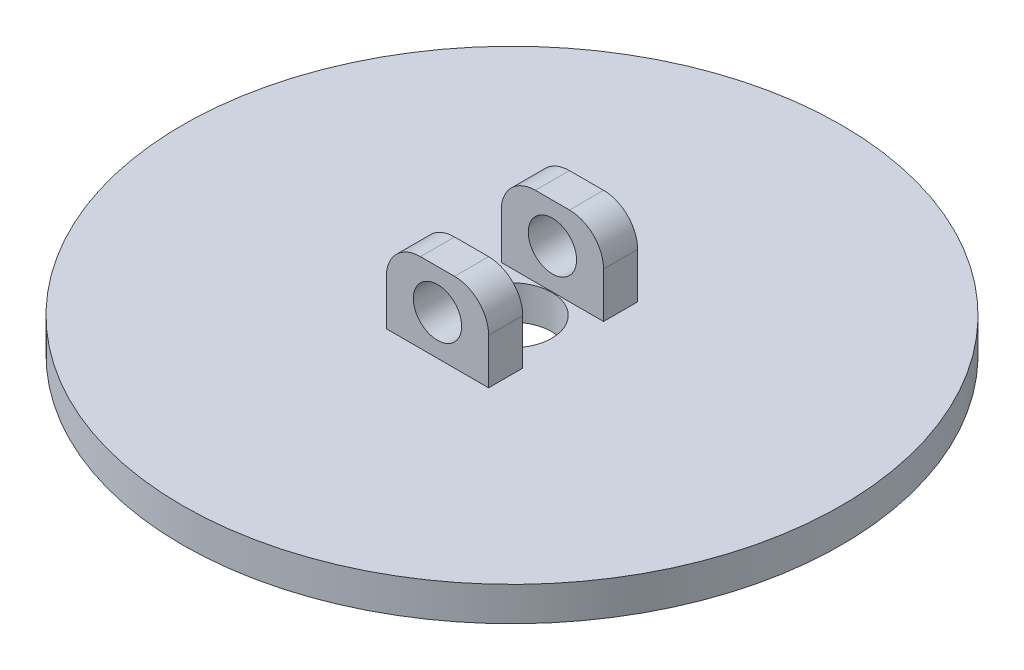
ISO-10303-21;
HEADER;
FILE_DESCRIPTION(('STEP AP214'),'2;1');
FILE_NAME('part.step','',(''),(''),'','','');
FILE_SCHEMA(('AUTOMOTIVE_DESIGN { 1 0 10303 214 1 1 1 1 }'));
ENDSEC;
DATA;
#1=APPLICATION_CONTEXT('core data for automotive mechanical design processes');
#2=APPLICATION_PROTOCOL_DEFINITION('international standard','automotive_design',2000,#1);
#3=PRODUCT_CONTEXT('',#1,'mechanical');
#4=PRODUCT('Part','Part','',(#3));
#5=PRODUCT_RELATED_PRODUCT_CATEGORY('part','',(#4));
#6=PRODUCT_DEFINITION_FORMATION('','',#4);
#7=PRODUCT_DEFINITION_CONTEXT('part definition',#1,'design');
#8=PRODUCT_DEFINITION('design','',#6,#7);
#9=PRODUCT_DEFINITION_SHAPE('','',#8);
#10=(LENGTH_UNIT() NAMED_UNIT(*) SI_UNIT(.MILLI.,.METRE.));
#11=(NAMED_UNIT(*) PLANE_ANGLE_UNIT() SI_UNIT($,.RADIAN.));
#12=(NAMED_UNIT(*) SI_UNIT($,.STERADIAN.) SOLID_ANGLE_UNIT());
#13=UNCERTAINTY_MEASURE_WITH_UNIT(LENGTH_MEASURE(1.E-05),#10,'distance_accuracy_value','');
#14=(GEOMETRIC_REPRESENTATION_CONTEXT(3) GLOBAL_UNCERTAINTY_ASSIGNED_CONTEXT((#13)) GLOBAL_UNIT_ASSIGNED_CONTEXT((#10,
#11,#12)) REPRESENTATION_CONTEXT('',''));
#15=CARTESIAN_POINT('',(0.,0.,0.));
#16=DIRECTION('',(0.,0.,1.));
#17=DIRECTION('',(1.,0.,0.));
#18=AXIS2_PLACEMENT_3D('',#15,#16,#17);
#19=CARTESIAN_POINT('',(4.5,10.,-6.55561035524943));
#20=DIRECTION('',(-1.,0.,0.));
#21=DIRECTION('',(0.,0.,1.));
#22=AXIS2_PLACEMENT_3D('',#19,#20,#21);
#23=PLANE('',#22);
#24=DIRECTION('',(0.,0.,-1.));
#25=VECTOR('',#24,1.);
#26=CARTESIAN_POINT('',(4.5,6.99999999999998,139.539641300568));
#27=LINE('',#26,#25);
#28=CARTESIAN_POINT('',(4.5,6.99999999999998,-3.55561035524943));
#29=VERTEX_POINT('',#28);
#30=CARTESIAN_POINT('',(4.5,6.99999999999998,-6.55561035524943));
#31=VERTEX_POINT('',#30);
#32=EDGE_CURVE('E415',#29,#31,#27,.T.);
#33=ORIENTED_EDGE('',*,*,#32,.F.);
#34=DIRECTION('',(0.,-1.,0.));
#35=VECTOR('',#34,1.);
#36=CARTESIAN_POINT('',(4.5,10.,-3.55561035524943));
#37=LINE('',#36,#35);
#38=CARTESIAN_POINT('',(4.5,3.,-3.55561035524943));
#39=VERTEX_POINT('',#38);
#40=EDGE_CURVE('E177',#29,#39,#37,.T.);
#41=ORIENTED_EDGE('',*,*,#40,.T.);
#42=DIRECTION('',(0.,0.,-1.));
#43=VECTOR('',#42,1.);
#44=CARTESIAN_POINT('',(4.5,3.,-6.55561035524943));
#45=LINE('',#44,#43);
#46=CARTESIAN_POINT('',(4.5,3.,-6.55561035524943));
#47=VERTEX_POINT('',#46);
#48=EDGE_CURVE('E170',#39,#47,#45,.T.);
#49=ORIENTED_EDGE('',*,*,#48,.T.);
#50=DIRECTION('',(0.,-1.,0.));
#51=VECTOR('',#50,1.);
#52=CARTESIAN_POINT('',(4.5,10.,-6.55561035524943));
#53=LINE('',#52,#51);
#54=EDGE_CURVE('E193',#31,#47,#53,.T.);
#55=ORIENTED_EDGE('',*,*,#54,.F.);
#56=EDGE_LOOP('',(#33,#41,#49,#55));
#57=FACE_BOUND('',#56,.T.);
#58=ADVANCED_FACE('F33',(#57),#23,.F.);
#59=CARTESIAN_POINT('',(-4.5,10.,-6.55561035524943));
#60=DIRECTION('',(0.,0.,1.));
#61=DIRECTION('',(1.,0.,0.));
#62=AXIS2_PLACEMENT_3D('',#59,#60,#61);
#63=PLANE('',#62);
#64=CARTESIAN_POINT('',(0.,6.5,-6.55561035524943));
#65=DIRECTION('',(0.,0.,1.));
#66=DIRECTION('',(1.,0.,0.));
#67=AXIS2_PLACEMENT_3D('',#64,#65,#66);
#68=CIRCLE('',#67,2.125);
#69=CARTESIAN_POINT('',(2.125,6.5,-6.55561035524943));
#70=VERTEX_POINT('',#69);
#71=EDGE_CURVE('E154',#70,#70,#68,.T.);
#72=ORIENTED_EDGE('',*,*,#71,.T.);
#73=EDGE_LOOP('',(#72));
#74=FACE_BOUND('',#73,.T.);
#75=CARTESIAN_POINT('',(-1.5,7.,-6.55561035524943));
#76=DIRECTION('',(0.,0.,1.));
#77=DIRECTION('',(1.,0.,0.));
#78=AXIS2_PLACEMENT_3D('',#75,#76,#77);
#79=CIRCLE('',#78,3.);
#80=CARTESIAN_POINT('',(-1.49999999999998,10.,-6.55561035524943));
#81=VERTEX_POINT('',#80);
#82=CARTESIAN_POINT('',(-4.5,7.,-6.55561035524943));
#83=VERTEX_POINT('',#82);
#84=EDGE_CURVE('E208',#81,#83,#79,.T.);
#85=ORIENTED_EDGE('',*,*,#84,.F.);
#86=DIRECTION('',(-1.,0.,0.));
#87=VECTOR('',#86,1.);
#88=CARTESIAN_POINT('',(-4.5,10.,-6.55561035524943));
#89=LINE('',#88,#87);
#90=CARTESIAN_POINT('',(1.5,10.,-6.55561035524943));
#91=VERTEX_POINT('',#90);
#92=EDGE_CURVE('E171',#91,#81,#89,.T.);
#93=ORIENTED_EDGE('',*,*,#92,.F.);
#94=CARTESIAN_POINT('',(1.5,7.,-6.55561035524943));
#95=DIRECTION('',(0.,0.,1.));
#96=DIRECTION('',(1.,0.,0.));
#97=AXIS2_PLACEMENT_3D('',#94,#95,#96);
#98=CIRCLE('',#97,3.);
#99=EDGE_CURVE('E402',#31,#91,#98,.T.);
#100=ORIENTED_EDGE('',*,*,#99,.F.);
#101=ORIENTED_EDGE('',*,*,#54,.T.);
#102=DIRECTION('',(-1.,0.,0.));
#103=VECTOR('',#102,1.);
#104=CARTESIAN_POINT('',(-4.5,3.,-6.55561035524943));
#105=LINE('',#104,#103);
#106=CARTESIAN_POINT('',(-4.5,3.,-6.55561035524943));
#107=VERTEX_POINT('',#106);
#108=EDGE_CURVE('E180',#47,#107,#105,.T.);
#109=ORIENTED_EDGE('',*,*,#108,.T.);
#110=DIRECTION('',(0.,-1.,0.));
#111=VECTOR('',#110,1.);
#112=CARTESIAN_POINT('',(-4.5,10.,-6.55561035524943));
#113=LINE('',#112,#111);
#114=EDGE_CURVE('E191',#83,#107,#113,.T.);
#115=ORIENTED_EDGE('',*,*,#114,.F.);
#116=EDGE_LOOP('',(#85,#93,#100,#101,#109,#115));
#117=FACE_BOUND('',#116,.T.);
#118=ADVANCED_FACE('F228',(#74,#117),#63,.F.);
#119=CARTESIAN_POINT('',(-4.5,10.,-3.55561035524943));
#120=DIRECTION('',(0.,0.,-1.));
#121=DIRECTION('',(-1.,0.,0.));
#122=AXIS2_PLACEMENT_3D('',#119,#120,#121);
#123=PLANE('',#122);
#124=CARTESIAN_POINT('',(0.,6.5,-3.55561035524943));
#125=DIRECTION('',(0.,0.,-1.));
#126=DIRECTION('',(-1.,0.,0.));
#127=AXIS2_PLACEMENT_3D('',#124,#125,#126);
#128=CIRCLE('',#127,2.125);
#129=CARTESIAN_POINT('',(2.125,6.5,-3.55561035524943));
#130=VERTEX_POINT('',#129);
#131=EDGE_CURVE('E212',#130,#130,#128,.T.);
#132=ORIENTED_EDGE('',*,*,#131,.T.);
#133=EDGE_LOOP('',(#132));
#134=FACE_BOUND('',#133,.T.);
#135=CARTESIAN_POINT('',(-1.5,7.,-3.55561035524943));
#136=DIRECTION('',(0.,0.,-1.));
#137=DIRECTION('',(-1.,0.,0.));
#138=AXIS2_PLACEMENT_3D('',#135,#136,#137);
#139=CIRCLE('',#138,3.);
#140=CARTESIAN_POINT('',(-4.5,7.,-3.55561035524943));
#141=VERTEX_POINT('',#140);
#142=CARTESIAN_POINT('',(-1.49999999999998,10.,-3.55561035524943));
#143=VERTEX_POINT('',#142);
#144=EDGE_CURVE('E58',#141,#143,#139,.T.);
#145=ORIENTED_EDGE('',*,*,#144,.F.);
#146=DIRECTION('',(0.,-1.,0.));
#147=VECTOR('',#146,1.);
#148=CARTESIAN_POINT('',(-4.5,10.,-3.55561035524943));
#149=LINE('',#148,#147);
#150=CARTESIAN_POINT('',(-4.5,3.,-3.55561035524943));
#151=VERTEX_POINT('',#150);
#152=EDGE_CURVE('E189',#141,#151,#149,.T.);
#153=ORIENTED_EDGE('',*,*,#152,.T.);
#154=DIRECTION('',(1.,0.,0.));
#155=VECTOR('',#154,1.);
#156=CARTESIAN_POINT('',(-4.5,3.,-3.55561035524943));
#157=LINE('',#156,#155);
#158=EDGE_CURVE('E174',#151,#39,#157,.T.);
#159=ORIENTED_EDGE('',*,*,#158,.T.);
#160=ORIENTED_EDGE('',*,*,#40,.F.);
#161=CARTESIAN_POINT('',(1.5,7.,-3.55561035524943));
#162=DIRECTION('',(0.,0.,-1.));
#163=DIRECTION('',(-1.,0.,0.));
#164=AXIS2_PLACEMENT_3D('',#161,#162,#163);
#165=CIRCLE('',#164,3.);
#166=CARTESIAN_POINT('',(1.49999999999998,10.,-3.55561035524943));
#167=VERTEX_POINT('',#166);
#168=EDGE_CURVE('E142',#167,#29,#165,.T.);
#169=ORIENTED_EDGE('',*,*,#168,.F.);
#170=DIRECTION('',(1.,0.,0.));
#171=VECTOR('',#170,1.);
#172=CARTESIAN_POINT('',(-4.5,10.,-3.55561035524943));
#173=LINE('',#172,#171);
#174=EDGE_CURVE('E173',#143,#167,#173,.T.);
#175=ORIENTED_EDGE('',*,*,#174,.F.);
#176=EDGE_LOOP('',(#145,#153,#159,#160,#169,#175));
#177=FACE_BOUND('',#176,.T.);
#178=ADVANCED_FACE('F253',(#134,#177),#123,.F.);
#179=CARTESIAN_POINT('',(0.,10.,0.));
#180=DIRECTION('',(0.,1.,0.));
#181=DIRECTION('',(0.,0.,1.));
#182=AXIS2_PLACEMENT_3D('',#179,#180,#181);
#183=PLANE('',#182);
#184=DIRECTION('',(0.,0.,-1.));
#185=VECTOR('',#184,1.);
#186=CARTESIAN_POINT('',(-1.49999999999998,10.,139.539641300568));
#187=LINE('',#186,#185);
#188=EDGE_CURVE('E43',#143,#81,#187,.T.);
#189=ORIENTED_EDGE('',*,*,#188,.F.);
#190=ORIENTED_EDGE('',*,*,#174,.T.);
#191=DIRECTION('',(0.,0.,-1.));
#192=VECTOR('',#191,1.);
#193=CARTESIAN_POINT('',(1.49999999999998,10.,139.539641300568));
#194=LINE('',#193,#192);
#195=EDGE_CURVE('E411',#167,#91,#194,.T.);
#196=ORIENTED_EDGE('',*,*,#195,.T.);
#197=ORIENTED_EDGE('',*,*,#92,.T.);
#198=EDGE_LOOP('',(#189,#190,#196,#197));
#199=FACE_BOUND('',#198,.T.);
#200=ADVANCED_FACE('F331',(#199),#183,.T.);
#201=CARTESIAN_POINT('',(-4.5,10.,6.55561035524943));
#202=DIRECTION('',(0.,0.,-1.));
#203=DIRECTION('',(-1.,0.,0.));
#204=AXIS2_PLACEMENT_3D('',#201,#202,#203);
#205=PLANE('',#204);
#206=CARTESIAN_POINT('',(0.,6.5,6.55561035524943));
#207=DIRECTION('',(0.,0.,-1.));
#208=DIRECTION('',(-1.,0.,0.));
#209=AXIS2_PLACEMENT_3D('',#206,#207,#208);
#210=CIRCLE('',#209,2.125);
#211=CARTESIAN_POINT('',(2.125,6.5,6.55561035524943));
#212=VERTEX_POINT('',#211);
#213=EDGE_CURVE('E207',#212,#212,#210,.T.);
#214=ORIENTED_EDGE('',*,*,#213,.T.);
#215=EDGE_LOOP('',(#214));
#216=FACE_BOUND('',#215,.T.);
#217=CARTESIAN_POINT('',(-1.5,7.,6.55561035524943));
#218=DIRECTION('',(0.,0.,-1.));
#219=DIRECTION('',(-1.,0.,0.));
#220=AXIS2_PLACEMENT_3D('',#217,#218,#219);
#221=CIRCLE('',#220,3.);
#222=CARTESIAN_POINT('',(-4.5,7.,6.55561035524943));
#223=VERTEX_POINT('',#222);
#224=CARTESIAN_POINT('',(-1.49999999999998,10.,6.55561035524943));
#225=VERTEX_POINT('',#224);
#226=EDGE_CURVE('E219',#223,#225,#221,.T.);
#227=ORIENTED_EDGE('',*,*,#226,.F.);
#228=DIRECTION('',(0.,-1.,0.));
#229=VECTOR('',#228,1.);
#230=CARTESIAN_POINT('',(-4.5,10.,6.55561035524943));
#231=LINE('',#230,#229);
#232=CARTESIAN_POINT('',(-4.5,3.,6.55561035524943));
#233=VERTEX_POINT('',#232);
#234=EDGE_CURVE('E148',#223,#233,#231,.T.);
#235=ORIENTED_EDGE('',*,*,#234,.T.);
#236=DIRECTION('',(1.,0.,0.));
#237=VECTOR('',#236,1.);
#238=CARTESIAN_POINT('',(-4.5,3.,6.55561035524943));
#239=LINE('',#238,#237);
#240=CARTESIAN_POINT('',(4.5,3.,6.55561035524943));
#241=VERTEX_POINT('',#240);
#242=EDGE_CURVE('E157',#233,#241,#239,.T.);
#243=ORIENTED_EDGE('',*,*,#242,.T.);
#244=DIRECTION('',(0.,-1.,0.));
#245=VECTOR('',#244,1.);
#246=CARTESIAN_POINT('',(4.5,10.,6.55561035524943));
#247=LINE('',#246,#245);
#248=CARTESIAN_POINT('',(4.5,6.99999999999998,6.55561035524943));
#249=VERTEX_POINT('',#248);
#250=EDGE_CURVE('E141',#249,#241,#247,.T.);
#251=ORIENTED_EDGE('',*,*,#250,.F.);
#252=CARTESIAN_POINT('',(1.5,7.,6.55561035524943));
#253=DIRECTION('',(0.,0.,-1.));
#254=DIRECTION('',(-1.,0.,0.));
#255=AXIS2_PLACEMENT_3D('',#252,#253,#254);
#256=CIRCLE('',#255,3.);
#257=CARTESIAN_POINT('',(1.49999999999998,10.,6.55561035524943));
#258=VERTEX_POINT('',#257);
#259=EDGE_CURVE('E126',#258,#249,#256,.T.);
#260=ORIENTED_EDGE('',*,*,#259,.F.);
#261=DIRECTION('',(1.,0.,0.));
#262=VECTOR('',#261,1.);
#263=CARTESIAN_POINT('',(-4.5,10.,6.55561035524943));
#264=LINE('',#263,#262);
#265=EDGE_CURVE('E138',#225,#258,#264,.T.);
#266=ORIENTED_EDGE('',*,*,#265,.F.);
#267=EDGE_LOOP('',(#227,#235,#243,#251,#260,#266));
#268=FACE_BOUND('',#267,.T.);
#269=ADVANCED_FACE('F137',(#216,#268),#205,.F.);
#270=CARTESIAN_POINT('',(4.5,10.,6.55561035524943));
#271=DIRECTION('',(-1.,0.,0.));
#272=DIRECTION('',(0.,0.,1.));
#273=AXIS2_PLACEMENT_3D('',#270,#271,#272);
#274=PLANE('',#273);
#275=CARTESIAN_POINT('',(4.5,6.99999999999998,3.55561035524943));
#276=VERTEX_POINT('',#275);
#277=EDGE_CURVE('E414',#249,#276,#27,.T.);
#278=ORIENTED_EDGE('',*,*,#277,.F.);
#279=ORIENTED_EDGE('',*,*,#250,.T.);
#280=DIRECTION('',(0.,0.,-1.));
#281=VECTOR('',#280,1.);
#282=CARTESIAN_POINT('',(4.5,3.,6.55561035524943));
#283=LINE('',#282,#281);
#284=CARTESIAN_POINT('',(4.5,3.,3.55561035524943));
#285=VERTEX_POINT('',#284);
#286=EDGE_CURVE('E159',#241,#285,#283,.T.);
#287=ORIENTED_EDGE('',*,*,#286,.T.);
#288=DIRECTION('',(0.,-1.,0.));
#289=VECTOR('',#288,1.);
#290=CARTESIAN_POINT('',(4.5,10.,3.55561035524943));
#291=LINE('',#290,#289);
#292=EDGE_CURVE('E167',#276,#285,#291,.T.);
#293=ORIENTED_EDGE('',*,*,#292,.F.);
#294=EDGE_LOOP('',(#278,#279,#287,#293));
#295=FACE_BOUND('',#294,.T.);
#296=ADVANCED_FACE('F349',(#295),#274,.F.);
#297=CARTESIAN_POINT('',(-4.5,10.,3.55561035524943));
#298=DIRECTION('',(0.,0.,1.));
#299=DIRECTION('',(1.,0.,0.));
#300=AXIS2_PLACEMENT_3D('',#297,#298,#299);
#301=PLANE('',#300);
#302=CARTESIAN_POINT('',(0.,6.5,3.55561035524942));
#303=DIRECTION('',(0.,0.,1.));
#304=DIRECTION('',(1.,0.,0.));
#305=AXIS2_PLACEMENT_3D('',#302,#303,#304);
#306=CIRCLE('',#305,2.125);
#307=CARTESIAN_POINT('',(2.125,6.5,3.55561035524942));
#308=VERTEX_POINT('',#307);
#309=EDGE_CURVE('E205',#308,#308,#306,.T.);
#310=ORIENTED_EDGE('',*,*,#309,.T.);
#311=EDGE_LOOP('',(#310));
#312=FACE_BOUND('',#311,.T.);
#313=CARTESIAN_POINT('',(-1.5,7.,3.55561035524943));
#314=DIRECTION('',(0.,0.,1.));
#315=DIRECTION('',(1.,0.,0.));
#316=AXIS2_PLACEMENT_3D('',#313,#314,#315);
#317=CIRCLE('',#316,3.);
#318=CARTESIAN_POINT('',(-1.49999999999998,10.,3.55561035524943));
#319=VERTEX_POINT('',#318);
#320=CARTESIAN_POINT('',(-4.5,7.,3.55561035524943));
#321=VERTEX_POINT('',#320);
#322=EDGE_CURVE('E399',#319,#321,#317,.T.);
#323=ORIENTED_EDGE('',*,*,#322,.F.);
#324=DIRECTION('',(-1.,0.,0.));
#325=VECTOR('',#324,1.);
#326=CARTESIAN_POINT('',(-4.5,10.,3.55561035524943));
#327=LINE('',#326,#325);
#328=CARTESIAN_POINT('',(1.5,10.,3.55561035524943));
#329=VERTEX_POINT('',#328);
#330=EDGE_CURVE('E145',#329,#319,#327,.T.);
#331=ORIENTED_EDGE('',*,*,#330,.F.);
#332=CARTESIAN_POINT('',(1.5,7.,3.55561035524943));
#333=DIRECTION('',(0.,0.,1.));
#334=DIRECTION('',(1.,0.,0.));
#335=AXIS2_PLACEMENT_3D('',#332,#333,#334);
#336=CIRCLE('',#335,3.);
#337=EDGE_CURVE('E129',#276,#329,#336,.T.);
#338=ORIENTED_EDGE('',*,*,#337,.F.);
#339=ORIENTED_EDGE('',*,*,#292,.T.);
#340=DIRECTION('',(-1.,0.,0.));
#341=VECTOR('',#340,1.);
#342=CARTESIAN_POINT('',(-4.5,3.,3.55561035524943));
#343=LINE('',#342,#341);
#344=CARTESIAN_POINT('',(-4.5,3.,3.55561035524943));
#345=VERTEX_POINT('',#344);
#346=EDGE_CURVE('E151',#285,#345,#343,.T.);
#347=ORIENTED_EDGE('',*,*,#346,.T.);
#348=DIRECTION('',(0.,-1.,0.));
#349=VECTOR('',#348,1.);
#350=CARTESIAN_POINT('',(-4.5,10.,3.55561035524943));
#351=LINE('',#350,#349);
#352=EDGE_CURVE('E165',#321,#345,#351,.T.);
#353=ORIENTED_EDGE('',*,*,#352,.F.);
#354=EDGE_LOOP('',(#323,#331,#338,#339,#347,#353));
#355=FACE_BOUND('',#354,.T.);
#356=ADVANCED_FACE('F359',(#312,#355),#301,.F.);
#357=CARTESIAN_POINT('',(0.,10.,0.));
#358=DIRECTION('',(0.,1.,0.));
#359=DIRECTION('',(0.,0.,1.));
#360=AXIS2_PLACEMENT_3D('',#357,#358,#359);
#361=PLANE('',#360);
#362=EDGE_CURVE('E11',#225,#319,#187,.T.);
#363=ORIENTED_EDGE('',*,*,#362,.F.);
#364=ORIENTED_EDGE('',*,*,#265,.T.);
#365=DIRECTION('',(0.,0.,-1.));
#366=VECTOR('',#365,1.);
#367=CARTESIAN_POINT('',(1.5,10.,139.539641300568));
#368=LINE('',#367,#366);
#369=EDGE_CURVE('E37',#258,#329,#368,.T.);
#370=ORIENTED_EDGE('',*,*,#369,.T.);
#371=ORIENTED_EDGE('',*,*,#330,.T.);
#372=EDGE_LOOP('',(#363,#364,#370,#371));
#373=FACE_BOUND('',#372,.T.);
#374=ADVANCED_FACE('F144',(#373),#361,.T.);
#375=CARTESIAN_POINT('',(0.,3.,0.));
#376=DIRECTION('',(0.,1.,0.));
#377=DIRECTION('',(0.,0.,1.));
#378=AXIS2_PLACEMENT_3D('',#375,#376,#377);
#379=PLANE('',#378);
#380=DIRECTION('',(0.,0.,1.));
#381=VECTOR('',#380,1.);
#382=CARTESIAN_POINT('',(-4.5,3.,-6.55561035524943));
#383=LINE('',#382,#381);
#384=EDGE_CURVE('E183',#107,#151,#383,.T.);
#385=ORIENTED_EDGE('',*,*,#384,.F.);
#386=ORIENTED_EDGE('',*,*,#108,.F.);
#387=ORIENTED_EDGE('',*,*,#48,.F.);
#388=ORIENTED_EDGE('',*,*,#158,.F.);
#389=EDGE_LOOP('',(#385,#386,#387,#388));
#390=FACE_BOUND('',#389,.T.);
#391=DIRECTION('',(0.,0.,1.));
#392=VECTOR('',#391,1.);
#393=CARTESIAN_POINT('',(-4.5,3.,6.55561035524943));
#394=LINE('',#393,#392);
#395=EDGE_CURVE('E146',#345,#233,#394,.T.);
#396=ORIENTED_EDGE('',*,*,#395,.F.);
#397=ORIENTED_EDGE('',*,*,#346,.F.);
#398=ORIENTED_EDGE('',*,*,#286,.F.);
#399=ORIENTED_EDGE('',*,*,#242,.F.);
#400=EDGE_LOOP('',(#396,#397,#398,#399));
#401=FACE_BOUND('',#400,.T.);
#402=CARTESIAN_POINT('',(0.,3.,0.));
#403=DIRECTION('',(0.,1.,0.));
#404=DIRECTION('',(0.,0.,1.));
#405=AXIS2_PLACEMENT_3D('',#402,#403,#404);
#406=CIRCLE('',#405,29.);
#407=CARTESIAN_POINT('',(0.,3.,29.));
#408=VERTEX_POINT('',#407);
#409=EDGE_CURVE('E133',#408,#408,#406,.T.);
#410=ORIENTED_EDGE('',*,*,#409,.T.);
#411=EDGE_LOOP('',(#410));
#412=FACE_BOUND('',#411,.T.);
#413=CARTESIAN_POINT('',(0.,3.,0.));
#414=DIRECTION('',(0.,1.,0.));
#415=DIRECTION('',(0.,0.,1.));
#416=AXIS2_PLACEMENT_3D('',#413,#414,#415);
#417=CIRCLE('',#416,3.5);
#418=CARTESIAN_POINT('',(0.,3.,3.5));
#419=VERTEX_POINT('',#418);
#420=EDGE_CURVE('E196',#419,#419,#417,.T.);
#421=ORIENTED_EDGE('',*,*,#420,.F.);
#422=EDGE_LOOP('',(#421));
#423=FACE_BOUND('',#422,.T.);
#424=ADVANCED_FACE('F263',(#390,#401,#412,#423),#379,.T.);
#425=CARTESIAN_POINT('',(0.,0.,0.));
#426=DIRECTION('',(0.,1.,0.));
#427=DIRECTION('',(0.,0.,1.));
#428=AXIS2_PLACEMENT_3D('',#425,#426,#427);
#429=PLANE('',#428);
#430=CARTESIAN_POINT('',(0.,0.,0.));
#431=DIRECTION('',(0.,1.,0.));
#432=DIRECTION('',(0.,0.,1.));
#433=AXIS2_PLACEMENT_3D('',#430,#431,#432);
#434=CIRCLE('',#433,29.);
#435=CARTESIAN_POINT('',(0.,0.,29.));
#436=VERTEX_POINT('',#435);
#437=EDGE_CURVE('E199',#436,#436,#434,.T.);
#438=ORIENTED_EDGE('',*,*,#437,.F.);
#439=EDGE_LOOP('',(#438));
#440=FACE_BOUND('',#439,.T.);
#441=CARTESIAN_POINT('',(0.,0.,0.));
#442=DIRECTION('',(0.,1.,0.));
#443=DIRECTION('',(0.,0.,1.));
#444=AXIS2_PLACEMENT_3D('',#441,#442,#443);
#445=CIRCLE('',#444,3.5);
#446=CARTESIAN_POINT('',(0.,0.,3.5));
#447=VERTEX_POINT('',#446);
#448=EDGE_CURVE('E195',#447,#447,#445,.T.);
#449=ORIENTED_EDGE('',*,*,#448,.T.);
#450=EDGE_LOOP('',(#449));
#451=FACE_BOUND('',#450,.T.);
#452=ADVANCED_FACE('F265',(#440,#451),#429,.F.);
#453=CARTESIAN_POINT('',(0.,3.,0.));
#454=DIRECTION('',(0.,-1.,0.));
#455=DIRECTION('',(0.,0.,-1.));
#456=AXIS2_PLACEMENT_3D('',#453,#454,#455);
#457=CYLINDRICAL_SURFACE('',#456,29.);
#458=ORIENTED_EDGE('',*,*,#409,.F.);
#459=EDGE_LOOP('',(#458));
#460=FACE_BOUND('',#459,.T.);
#461=ORIENTED_EDGE('',*,*,#437,.T.);
#462=EDGE_LOOP('',(#461));
#463=FACE_BOUND('',#462,.T.);
#464=ADVANCED_FACE('F35',(#460,#463),#457,.T.);
#465=CARTESIAN_POINT('',(0.,3.,0.));
#466=DIRECTION('',(0.,-1.,0.));
#467=DIRECTION('',(0.,0.,-1.));
#468=AXIS2_PLACEMENT_3D('',#465,#466,#467);
#469=CYLINDRICAL_SURFACE('',#468,3.5);
#470=ORIENTED_EDGE('',*,*,#420,.T.);
#471=EDGE_LOOP('',(#470));
#472=FACE_BOUND('',#471,.T.);
#473=ORIENTED_EDGE('',*,*,#448,.F.);
#474=EDGE_LOOP('',(#473));
#475=FACE_BOUND('',#474,.T.);
#476=ADVANCED_FACE('F258',(#472,#475),#469,.F.);
#477=CARTESIAN_POINT('',(-4.5,10.,-6.55561035524943));
#478=DIRECTION('',(1.,0.,0.));
#479=DIRECTION('',(0.,0.,-1.));
#480=AXIS2_PLACEMENT_3D('',#477,#478,#479);
#481=PLANE('',#480);
#482=ORIENTED_EDGE('',*,*,#152,.F.);
#483=DIRECTION('',(0.,0.,-1.));
#484=VECTOR('',#483,1.);
#485=CARTESIAN_POINT('',(-4.5,6.99999999999998,139.539641300568));
#486=LINE('',#485,#484);
#487=EDGE_CURVE('E50',#141,#83,#486,.T.);
#488=ORIENTED_EDGE('',*,*,#487,.T.);
#489=ORIENTED_EDGE('',*,*,#114,.T.);
#490=ORIENTED_EDGE('',*,*,#384,.T.);
#491=EDGE_LOOP('',(#482,#488,#489,#490));
#492=FACE_BOUND('',#491,.T.);
#493=ADVANCED_FACE('F261',(#492),#481,.F.);
#494=CARTESIAN_POINT('',(-4.5,10.,6.55561035524943));
#495=DIRECTION('',(1.,0.,0.));
#496=DIRECTION('',(0.,0.,-1.));
#497=AXIS2_PLACEMENT_3D('',#494,#495,#496);
#498=PLANE('',#497);
#499=ORIENTED_EDGE('',*,*,#234,.F.);
#500=EDGE_CURVE('E404',#223,#321,#486,.T.);
#501=ORIENTED_EDGE('',*,*,#500,.T.);
#502=ORIENTED_EDGE('',*,*,#352,.T.);
#503=ORIENTED_EDGE('',*,*,#395,.T.);
#504=EDGE_LOOP('',(#499,#501,#502,#503));
#505=FACE_BOUND('',#504,.T.);
#506=ADVANCED_FACE('F243',(#505),#498,.F.);
#507=CARTESIAN_POINT('',(0.,6.5,-29.));
#508=DIRECTION('',(0.,0.,1.));
#509=DIRECTION('',(1.,0.,0.));
#510=AXIS2_PLACEMENT_3D('',#507,#508,#509);
#511=CYLINDRICAL_SURFACE('',#510,2.125);
#512=CARTESIAN_POINT('',(2.125,6.5,3.55561035524942));
#513=CARTESIAN_POINT('',(2.125,6.5,3.58686035524942));
#514=CARTESIAN_POINT('',(2.125,6.5,3.61811035524942));
#515=CARTESIAN_POINT('',(2.125,6.5,3.68061035524942));
#516=CARTESIAN_POINT('',(2.125,6.5,3.71186035524942));
#517=CARTESIAN_POINT('',(2.125,6.5,3.77436035524942));
#518=CARTESIAN_POINT('',(2.125,6.5,3.80561035524942));
#519=CARTESIAN_POINT('',(2.125,6.5,3.86811035524942));
#520=CARTESIAN_POINT('',(2.125,6.5,3.89936035524942));
#521=CARTESIAN_POINT('',(2.125,6.5,3.96186035524942));
#522=CARTESIAN_POINT('',(2.125,6.5,3.99311035524942));
#523=CARTESIAN_POINT('',(2.125,6.5,4.05561035524942));
#524=CARTESIAN_POINT('',(2.125,6.5,4.08686035524942));
#525=CARTESIAN_POINT('',(2.125,6.5,4.14936035524942));
#526=CARTESIAN_POINT('',(2.125,6.5,4.18061035524942));
#527=CARTESIAN_POINT('',(2.125,6.5,4.24311035524942));
#528=CARTESIAN_POINT('',(2.125,6.5,4.27436035524942));
#529=CARTESIAN_POINT('',(2.125,6.5,4.33686035524942));
#530=CARTESIAN_POINT('',(2.125,6.5,4.36811035524942));
#531=CARTESIAN_POINT('',(2.125,6.5,4.43061035524942));
#532=CARTESIAN_POINT('',(2.125,6.5,4.46186035524942));
#533=CARTESIAN_POINT('',(2.125,6.5,4.52436035524942));
#534=CARTESIAN_POINT('',(2.125,6.5,4.55561035524942));
#535=CARTESIAN_POINT('',(2.125,6.5,4.61811035524942));
#536=CARTESIAN_POINT('',(2.125,6.5,4.64936035524942));
#537=CARTESIAN_POINT('',(2.125,6.5,4.71186035524942));
#538=CARTESIAN_POINT('',(2.125,6.5,4.74311035524942));
#539=CARTESIAN_POINT('',(2.125,6.5,4.80561035524942));
#540=CARTESIAN_POINT('',(2.125,6.5,4.83686035524942));
#541=CARTESIAN_POINT('',(2.125,6.5,4.89936035524942));
#542=CARTESIAN_POINT('',(2.125,6.5,4.93061035524942));
#543=CARTESIAN_POINT('',(2.125,6.5,4.99311035524942));
#544=CARTESIAN_POINT('',(2.125,6.5,5.02436035524943));
#545=CARTESIAN_POINT('',(2.125,6.5,5.08686035524943));
#546=CARTESIAN_POINT('',(2.125,6.5,5.11811035524943));
#547=CARTESIAN_POINT('',(2.125,6.5,5.18061035524943));
#548=CARTESIAN_POINT('',(2.125,6.5,5.21186035524943));
#549=CARTESIAN_POINT('',(2.125,6.5,5.27436035524943));
#550=CARTESIAN_POINT('',(2.125,6.5,5.30561035524943));
#551=CARTESIAN_POINT('',(2.125,6.5,5.36811035524943));
#552=CARTESIAN_POINT('',(2.125,6.5,5.39936035524943));
#553=CARTESIAN_POINT('',(2.125,6.5,5.46186035524943));
#554=CARTESIAN_POINT('',(2.125,6.5,5.49311035524943));
#555=CARTESIAN_POINT('',(2.125,6.5,5.55561035524943));
#556=CARTESIAN_POINT('',(2.125,6.5,5.58686035524943));
#557=CARTESIAN_POINT('',(2.125,6.5,5.64936035524943));
#558=CARTESIAN_POINT('',(2.125,6.5,5.68061035524943));
#559=CARTESIAN_POINT('',(2.125,6.5,5.74311035524943));
#560=CARTESIAN_POINT('',(2.125,6.5,5.77436035524943));
#561=CARTESIAN_POINT('',(2.125,6.5,5.83686035524943));
#562=CARTESIAN_POINT('',(2.125,6.5,5.86811035524943));
#563=CARTESIAN_POINT('',(2.125,6.5,5.93061035524943));
#564=CARTESIAN_POINT('',(2.125,6.5,5.96186035524943));
#565=CARTESIAN_POINT('',(2.125,6.5,6.02436035524943));
#566=CARTESIAN_POINT('',(2.125,6.5,6.05561035524943));
#567=CARTESIAN_POINT('',(2.125,6.5,6.11811035524943));
#568=CARTESIAN_POINT('',(2.125,6.5,6.14936035524943));
#569=CARTESIAN_POINT('',(2.125,6.5,6.21186035524943));
#570=CARTESIAN_POINT('',(2.125,6.5,6.24311035524943));
#571=CARTESIAN_POINT('',(2.125,6.5,6.30561035524943));
#572=CARTESIAN_POINT('',(2.125,6.5,6.33686035524943));
#573=CARTESIAN_POINT('',(2.125,6.5,6.39936035524943));
#574=CARTESIAN_POINT('',(2.125,6.5,6.43061035524943));
#575=CARTESIAN_POINT('',(2.125,6.5,6.49311035524943));
#576=CARTESIAN_POINT('',(2.125,6.5,6.52436035524943));
#577=CARTESIAN_POINT('',(2.125,6.5,6.55561035524943));
#578=B_SPLINE_CURVE_WITH_KNOTS('',3,(#512,#513,#514,#515,#516,#517,#518,#519,#520,#521,#522,
#523,#524,#525,#526,#527,#528,#529,#530,#531,#532,#533,#534,#535,#536,#537,#538,#539,#540,#541,
#542,#543,#544,#545,#546,#547,#548,#549,#550,#551,#552,#553,#554,#555,#556,#557,#558,#559,#560,
#561,#562,#563,#564,#565,#566,#567,#568,#569,#570,#571,#572,#573,#574,#575,#576,#577),
.UNSPECIFIED.,.F.,.F.,(4,2,2,2,2,2,2,2,2,2,2,2,2,2,2,2,2,2,2,2,2,2,2,2,2,2,2,2,2,2,2,2,4),(0.,
0.0937500000000036,0.1875,0.281250000000004,0.375,0.468750000000004,0.5625,0.656250000000004,
0.750000000000001,0.843750000000004,0.937500000000008,1.03125,1.12500000000001,1.21875,
1.31250000000001,1.40625,1.50000000000001,1.59375000000001,1.68750000000001,1.78125000000001,
1.87500000000001,1.96875000000001,2.06250000000001,2.15625000000001,2.25000000000002,
2.34375000000001,2.43750000000002,2.53125000000001,2.62500000000002,2.71875000000001,
2.81250000000002,2.90625000000001,3.00000000000002),.UNSPECIFIED.);
#579=EDGE_CURVE('BSEAM233',#308,#212,#578,.T.);
#580=ORIENTED_EDGE('',*,*,#309,.F.);
#581=ORIENTED_EDGE('',*,*,#213,.F.);
#582=ORIENTED_EDGE('',*,*,#579,.T.);
#583=ORIENTED_EDGE('',*,*,#579,.F.);
#584=EDGE_LOOP('',(#580,#582,#581,#583));
#585=FACE_BOUND('',#584,.T.);
#586=ADVANCED_FACE('F233',(#585),#511,.F.);
#587=CARTESIAN_POINT('',(2.125,6.5,-3.55561035524943));
#588=CARTESIAN_POINT('',(2.125,6.5,-3.58686035524943));
#589=CARTESIAN_POINT('',(2.125,6.5,-3.61811035524943));
#590=CARTESIAN_POINT('',(2.125,6.5,-3.68061035524943));
#591=CARTESIAN_POINT('',(2.125,6.5,-3.71186035524943));
#592=CARTESIAN_POINT('',(2.125,6.5,-3.77436035524943));
#593=CARTESIAN_POINT('',(2.125,6.5,-3.80561035524943));
#594=CARTESIAN_POINT('',(2.125,6.5,-3.86811035524943));
#595=CARTESIAN_POINT('',(2.125,6.5,-3.89936035524943));
#596=CARTESIAN_POINT('',(2.125,6.5,-3.96186035524943));
#597=CARTESIAN_POINT('',(2.125,6.5,-3.99311035524943));
#598=CARTESIAN_POINT('',(2.125,6.5,-4.05561035524943));
#599=CARTESIAN_POINT('',(2.125,6.5,-4.08686035524943));
#600=CARTESIAN_POINT('',(2.125,6.5,-4.14936035524943));
#601=CARTESIAN_POINT('',(2.125,6.5,-4.18061035524943));
#602=CARTESIAN_POINT('',(2.125,6.5,-4.24311035524943));
#603=CARTESIAN_POINT('',(2.125,6.5,-4.27436035524943));
#604=CARTESIAN_POINT('',(2.125,6.5,-4.33686035524943));
#605=CARTESIAN_POINT('',(2.125,6.5,-4.36811035524943));
#606=CARTESIAN_POINT('',(2.125,6.5,-4.43061035524943));
#607=CARTESIAN_POINT('',(2.125,6.5,-4.46186035524943));
#608=CARTESIAN_POINT('',(2.125,6.5,-4.52436035524943));
#609=CARTESIAN_POINT('',(2.125,6.5,-4.55561035524943));
#610=CARTESIAN_POINT('',(2.125,6.5,-4.61811035524943));
#611=CARTESIAN_POINT('',(2.125,6.5,-4.64936035524943));
#612=CARTESIAN_POINT('',(2.125,6.5,-4.71186035524943));
#613=CARTESIAN_POINT('',(2.125,6.5,-4.74311035524943));
#614=CARTESIAN_POINT('',(2.125,6.5,-4.80561035524943));
#615=CARTESIAN_POINT('',(2.125,6.5,-4.83686035524943));
#616=CARTESIAN_POINT('',(2.125,6.5,-4.89936035524943));
#617=CARTESIAN_POINT('',(2.125,6.5,-4.93061035524943));
#618=CARTESIAN_POINT('',(2.125,6.5,-4.99311035524943));
#619=CARTESIAN_POINT('',(2.125,6.5,-5.02436035524943));
#620=CARTESIAN_POINT('',(2.125,6.5,-5.08686035524943));
#621=CARTESIAN_POINT('',(2.125,6.5,-5.11811035524943));
#622=CARTESIAN_POINT('',(2.125,6.5,-5.18061035524943));
#623=CARTESIAN_POINT('',(2.125,6.5,-5.21186035524943));
#624=CARTESIAN_POINT('',(2.125,6.5,-5.27436035524943));
#625=CARTESIAN_POINT('',(2.125,6.5,-5.30561035524943));
#626=CARTESIAN_POINT('',(2.125,6.5,-5.36811035524943));
#627=CARTESIAN_POINT('',(2.125,6.5,-5.39936035524943));
#628=CARTESIAN_POINT('',(2.125,6.5,-5.46186035524943));
#629=CARTESIAN_POINT('',(2.125,6.5,-5.49311035524943));
#630=CARTESIAN_POINT('',(2.125,6.5,-5.55561035524943));
#631=CARTESIAN_POINT('',(2.125,6.5,-5.58686035524943));
#632=CARTESIAN_POINT('',(2.125,6.5,-5.64936035524943));
#633=CARTESIAN_POINT('',(2.125,6.5,-5.68061035524943));
#634=CARTESIAN_POINT('',(2.125,6.5,-5.74311035524943));
#635=CARTESIAN_POINT('',(2.125,6.5,-5.77436035524943));
#636=CARTESIAN_POINT('',(2.125,6.5,-5.83686035524943));
#637=CARTESIAN_POINT('',(2.125,6.5,-5.86811035524943));
#638=CARTESIAN_POINT('',(2.125,6.5,-5.93061035524943));
#639=CARTESIAN_POINT('',(2.125,6.5,-5.96186035524943));
#640=CARTESIAN_POINT('',(2.125,6.5,-6.02436035524943));
#641=CARTESIAN_POINT('',(2.125,6.5,-6.05561035524943));
#642=CARTESIAN_POINT('',(2.125,6.5,-6.11811035524943));
#643=CARTESIAN_POINT('',(2.125,6.5,-6.14936035524943));
#644=CARTESIAN_POINT('',(2.125,6.5,-6.21186035524943));
#645=CARTESIAN_POINT('',(2.125,6.5,-6.24311035524943));
#646=CARTESIAN_POINT('',(2.125,6.5,-6.30561035524943));
#647=CARTESIAN_POINT('',(2.125,6.5,-6.33686035524943));
#648=CARTESIAN_POINT('',(2.125,6.5,-6.39936035524943));
#649=CARTESIAN_POINT('',(2.125,6.5,-6.43061035524943));
#650=CARTESIAN_POINT('',(2.125,6.5,-6.49311035524943));
#651=CARTESIAN_POINT('',(2.125,6.5,-6.52436035524943));
#652=CARTESIAN_POINT('',(2.125,6.5,-6.55561035524943));
#653=B_SPLINE_CURVE_WITH_KNOTS('',3,(#587,#588,#589,#590,#591,#592,#593,#594,#595,#596,#597,
#598,#599,#600,#601,#602,#603,#604,#605,#606,#607,#608,#609,#610,#611,#612,#613,#614,#615,#616,
#617,#618,#619,#620,#621,#622,#623,#624,#625,#626,#627,#628,#629,#630,#631,#632,#633,#634,#635,
#636,#637,#638,#639,#640,#641,#642,#643,#644,#645,#646,#647,#648,#649,#650,#651,#652),
.UNSPECIFIED.,.F.,.F.,(4,2,2,2,2,2,2,2,2,2,2,2,2,2,2,2,2,2,2,2,2,2,2,2,2,2,2,2,2,2,2,2,4),(0.,
0.0937500000000001,0.1875,0.28125,0.375,0.46875,0.5625,0.656250000000001,0.750000000000001,
0.843750000000001,0.937500000000001,1.03125,1.125,1.21875,1.3125,1.40625,1.5,1.59375,1.6875,
1.78125,1.875,1.96875,2.0625,2.15625,2.25,2.34375,2.4375,2.53125,2.625,2.71875,2.8125,2.90625,
3.),.UNSPECIFIED.);
#654=EDGE_CURVE('BSEAM231',#130,#70,#653,.T.);
#655=ORIENTED_EDGE('',*,*,#131,.F.);
#656=ORIENTED_EDGE('',*,*,#71,.F.);
#657=ORIENTED_EDGE('',*,*,#654,.T.);
#658=ORIENTED_EDGE('',*,*,#654,.F.);
#659=EDGE_LOOP('',(#655,#657,#656,#658));
#660=FACE_BOUND('',#659,.T.);
#661=ADVANCED_FACE('F231',(#660),#511,.F.);
#662=CARTESIAN_POINT('',(1.5,7.,139.539641300568));
#663=DIRECTION('',(0.,0.,-1.));
#664=DIRECTION('',(-1.,0.,0.));
#665=AXIS2_PLACEMENT_3D('',#662,#663,#664);
#666=CYLINDRICAL_SURFACE('',#665,3.);
#667=ORIENTED_EDGE('',*,*,#369,.F.);
#668=ORIENTED_EDGE('',*,*,#259,.T.);
#669=ORIENTED_EDGE('',*,*,#277,.T.);
#670=ORIENTED_EDGE('',*,*,#337,.T.);
#671=EDGE_LOOP('',(#667,#668,#669,#670));
#672=FACE_BOUND('',#671,.T.);
#673=ADVANCED_FACE('F125',(#672),#666,.T.);
#674=CARTESIAN_POINT('',(-1.5,7.,139.539641300568));
#675=DIRECTION('',(0.,0.,-1.));
#676=DIRECTION('',(-1.,0.,0.));
#677=AXIS2_PLACEMENT_3D('',#674,#675,#676);
#678=CYLINDRICAL_SURFACE('',#677,3.);
#679=ORIENTED_EDGE('',*,*,#500,.F.);
#680=ORIENTED_EDGE('',*,*,#226,.T.);
#681=ORIENTED_EDGE('',*,*,#362,.T.);
#682=ORIENTED_EDGE('',*,*,#322,.T.);
#683=EDGE_LOOP('',(#679,#680,#681,#682));
#684=FACE_BOUND('',#683,.T.);
#685=ADVANCED_FACE('F240',(#684),#678,.T.);
#686=ORIENTED_EDGE('',*,*,#32,.T.);
#687=ORIENTED_EDGE('',*,*,#99,.T.);
#688=ORIENTED_EDGE('',*,*,#195,.F.);
#689=ORIENTED_EDGE('',*,*,#168,.T.);
#690=EDGE_LOOP('',(#686,#687,#688,#689));
#691=FACE_BOUND('',#690,.T.);
#692=ADVANCED_FACE('F242',(#691),#666,.T.);
#693=ORIENTED_EDGE('',*,*,#188,.T.);
#694=ORIENTED_EDGE('',*,*,#84,.T.);
#695=ORIENTED_EDGE('',*,*,#487,.F.);
#696=ORIENTED_EDGE('',*,*,#144,.T.);
#697=EDGE_LOOP('',(#693,#694,#695,#696));
#698=FACE_BOUND('',#697,.T.);
#699=ADVANCED_FACE('F432',(#698),#678,.T.);
#700=CLOSED_SHELL('',(#58,#118,#178,#200,#269,#296,#356,#374,#424,#452,#464,#476,#493,#506,#586,
#661,#673,#685,#692,#699));
#701=MANIFOLD_SOLID_BREP('B2',#700);
#702=ADVANCED_BREP_SHAPE_REPRESENTATION('',(#18,#701),#14);
#703=SHAPE_DEFINITION_REPRESENTATION(#9,#702);
ENDSEC;
END-ISO-10303-21;
